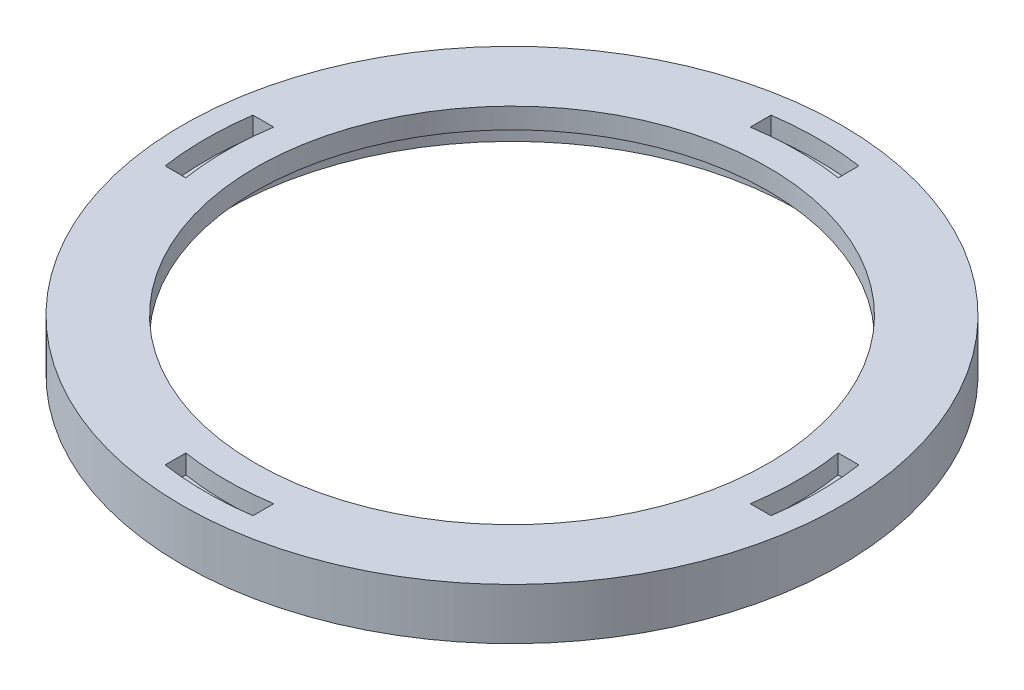
ISO-10303-21;
HEADER;
FILE_DESCRIPTION(('STEP AP214'),'2;1');
FILE_NAME('part.step','',(''),(''),'','','');
FILE_SCHEMA(('AUTOMOTIVE_DESIGN { 1 0 10303 214 1 1 1 1 }'));
ENDSEC;
DATA;
#1=APPLICATION_CONTEXT('core data for automotive mechanical design processes');
#2=APPLICATION_PROTOCOL_DEFINITION('international standard','automotive_design',2000,#1);
#3=PRODUCT_CONTEXT('',#1,'mechanical');
#4=PRODUCT('Part','Part','',(#3));
#5=PRODUCT_RELATED_PRODUCT_CATEGORY('part','',(#4));
#6=PRODUCT_DEFINITION_FORMATION('','',#4);
#7=PRODUCT_DEFINITION_CONTEXT('part definition',#1,'design');
#8=PRODUCT_DEFINITION('design','',#6,#7);
#9=PRODUCT_DEFINITION_SHAPE('','',#8);
#10=(LENGTH_UNIT() NAMED_UNIT(*) SI_UNIT(.MILLI.,.METRE.));
#11=(NAMED_UNIT(*) PLANE_ANGLE_UNIT() SI_UNIT($,.RADIAN.));
#12=(NAMED_UNIT(*) SI_UNIT($,.STERADIAN.) SOLID_ANGLE_UNIT());
#13=UNCERTAINTY_MEASURE_WITH_UNIT(LENGTH_MEASURE(1.E-05),#10,'distance_accuracy_value','');
#14=(GEOMETRIC_REPRESENTATION_CONTEXT(3) GLOBAL_UNCERTAINTY_ASSIGNED_CONTEXT((#13)) GLOBAL_UNIT_ASSIGNED_CONTEXT((#10,
#11,#12)) REPRESENTATION_CONTEXT('',''));
#15=CARTESIAN_POINT('',(0.,0.,0.));
#16=DIRECTION('',(0.,0.,1.));
#17=DIRECTION('',(1.,0.,0.));
#18=AXIS2_PLACEMENT_3D('',#15,#16,#17);
#19=CARTESIAN_POINT('',(0.,-4.445,0.));
#20=DIRECTION('',(0.,1.,0.));
#21=DIRECTION('',(0.,0.,1.));
#22=AXIS2_PLACEMENT_3D('',#19,#20,#21);
#23=CYLINDRICAL_SURFACE('',#22,22.225);
#24=CARTESIAN_POINT('',(0.,0.,0.));
#25=DIRECTION('',(0.,1.,0.));
#26=DIRECTION('',(0.,0.,1.));
#27=AXIS2_PLACEMENT_3D('',#24,#25,#26);
#28=CIRCLE('',#27,22.225);
#29=CARTESIAN_POINT('',(0.,0.,22.225));
#30=VERTEX_POINT('',#29);
#31=EDGE_CURVE('E275',#30,#30,#28,.T.);
#32=ORIENTED_EDGE('',*,*,#31,.T.);
#33=EDGE_LOOP('',(#32));
#34=FACE_BOUND('',#33,.T.);
#35=CARTESIAN_POINT('',(0.,-1.778,0.));
#36=DIRECTION('',(0.,-1.,0.));
#37=DIRECTION('',(0.,0.,-1.));
#38=AXIS2_PLACEMENT_3D('',#35,#36,#37);
#39=CIRCLE('',#38,22.225);
#40=CARTESIAN_POINT('',(0.,-1.778,-22.225));
#41=VERTEX_POINT('',#40);
#42=EDGE_CURVE('E38',#41,#41,#39,.F.);
#43=ORIENTED_EDGE('',*,*,#42,.F.);
#44=EDGE_LOOP('',(#43));
#45=FACE_BOUND('',#44,.T.);
#46=ADVANCED_FACE('F34',(#34,#45),#23,.F.);
#47=CARTESIAN_POINT('',(0.,0.,0.));
#48=DIRECTION('',(0.,1.,0.));
#49=DIRECTION('',(0.,0.,1.));
#50=AXIS2_PLACEMENT_3D('',#47,#48,#49);
#51=PLANE('',#50);
#52=CARTESIAN_POINT('',(0.,0.,0.));
#53=DIRECTION('',(0.,-1.,0.));
#54=DIRECTION('',(0.,0.,-1.));
#55=AXIS2_PLACEMENT_3D('',#52,#53,#54);
#56=CIRCLE('',#55,24.765);
#57=CARTESIAN_POINT('',(3.81000000000008,0.,24.4701680623571));
#58=VERTEX_POINT('',#57);
#59=CARTESIAN_POINT('',(-3.80999999999992,0.,24.4701680623571));
#60=VERTEX_POINT('',#59);
#61=EDGE_CURVE('E51',#58,#60,#56,.T.);
#62=ORIENTED_EDGE('',*,*,#61,.F.);
#63=DIRECTION('',(0.,0.,1.));
#64=VECTOR('',#63,1.);
#65=CARTESIAN_POINT('',(3.81000000000008,0.,24.4701680623571));
#66=LINE('',#65,#64);
#67=CARTESIAN_POINT('',(3.81000000000008,0.,26.2681318140442));
#68=VERTEX_POINT('',#67);
#69=EDGE_CURVE('E169',#58,#68,#66,.T.);
#70=ORIENTED_EDGE('',*,*,#69,.T.);
#71=CARTESIAN_POINT('',(0.,0.,0.));
#72=DIRECTION('',(0.,-1.,0.));
#73=DIRECTION('',(0.,0.,-1.));
#74=AXIS2_PLACEMENT_3D('',#71,#72,#73);
#75=CIRCLE('',#74,26.543);
#76=CARTESIAN_POINT('',(-3.80999999999991,0.,26.2681318140442));
#77=VERTEX_POINT('',#76);
#78=EDGE_CURVE('E172',#68,#77,#75,.T.);
#79=ORIENTED_EDGE('',*,*,#78,.T.);
#80=DIRECTION('',(0.,0.,1.));
#81=VECTOR('',#80,1.);
#82=CARTESIAN_POINT('',(-3.80999999999992,0.,24.4701680623571));
#83=LINE('',#82,#81);
#84=EDGE_CURVE('E181',#60,#77,#83,.T.);
#85=ORIENTED_EDGE('',*,*,#84,.F.);
#86=EDGE_LOOP('',(#62,#70,#79,#85));
#87=FACE_BOUND('',#86,.T.);
#88=CARTESIAN_POINT('',(0.,0.,0.));
#89=DIRECTION('',(0.,1.,0.));
#90=DIRECTION('',(0.,0.,1.));
#91=AXIS2_PLACEMENT_3D('',#88,#89,#90);
#92=CIRCLE('',#91,26.543);
#93=CARTESIAN_POINT('',(-26.2681318140442,0.,-3.81000000000001));
#94=VERTEX_POINT('',#93);
#95=CARTESIAN_POINT('',(-26.2681318140442,0.,3.80999999999998));
#96=VERTEX_POINT('',#95);
#97=EDGE_CURVE('E59',#94,#96,#92,.T.);
#98=ORIENTED_EDGE('',*,*,#97,.F.);
#99=DIRECTION('',(-1.,0.,0.));
#100=VECTOR('',#99,1.);
#101=CARTESIAN_POINT('',(-24.4701680623571,0.,-3.80999999999999));
#102=LINE('',#101,#100);
#103=CARTESIAN_POINT('',(-24.4701680623571,0.,-3.80999999999999));
#104=VERTEX_POINT('',#103);
#105=EDGE_CURVE('E194',#104,#94,#102,.T.);
#106=ORIENTED_EDGE('',*,*,#105,.F.);
#107=CARTESIAN_POINT('',(0.,0.,0.));
#108=DIRECTION('',(0.,1.,0.));
#109=DIRECTION('',(0.,0.,1.));
#110=AXIS2_PLACEMENT_3D('',#107,#108,#109);
#111=CIRCLE('',#110,24.765);
#112=CARTESIAN_POINT('',(-24.4701680623571,0.,3.81));
#113=VERTEX_POINT('',#112);
#114=EDGE_CURVE('E206',#104,#113,#111,.T.);
#115=ORIENTED_EDGE('',*,*,#114,.T.);
#116=DIRECTION('',(-1.,0.,0.));
#117=VECTOR('',#116,1.);
#118=CARTESIAN_POINT('',(-24.4701680623571,0.,3.81000000000001));
#119=LINE('',#118,#117);
#120=EDGE_CURVE('E203',#113,#96,#119,.T.);
#121=ORIENTED_EDGE('',*,*,#120,.T.);
#122=EDGE_LOOP('',(#98,#106,#115,#121));
#123=FACE_BOUND('',#122,.T.);
#124=CARTESIAN_POINT('',(0.,0.,0.));
#125=DIRECTION('',(0.,1.,0.));
#126=DIRECTION('',(0.,0.,1.));
#127=AXIS2_PLACEMENT_3D('',#124,#125,#126);
#128=CIRCLE('',#127,28.575);
#129=CARTESIAN_POINT('',(0.,0.,28.575));
#130=VERTEX_POINT('',#129);
#131=EDGE_CURVE('E43',#130,#130,#128,.T.);
#132=ORIENTED_EDGE('',*,*,#131,.T.);
#133=EDGE_LOOP('',(#132));
#134=FACE_BOUND('',#133,.T.);
#135=ORIENTED_EDGE('',*,*,#31,.F.);
#136=EDGE_LOOP('',(#135));
#137=FACE_BOUND('',#136,.T.);
#138=CARTESIAN_POINT('',(0.,0.,0.));
#139=DIRECTION('',(0.,-1.,0.));
#140=DIRECTION('',(0.,0.,-1.));
#141=AXIS2_PLACEMENT_3D('',#138,#139,#140);
#142=CIRCLE('',#141,24.765);
#143=CARTESIAN_POINT('',(-3.81000000000009,0.,-24.4701680623571));
#144=VERTEX_POINT('',#143);
#145=CARTESIAN_POINT('',(3.80999999999991,0.,-24.4701680623571));
#146=VERTEX_POINT('',#145);
#147=EDGE_CURVE('E251',#144,#146,#142,.T.);
#148=ORIENTED_EDGE('',*,*,#147,.F.);
#149=DIRECTION('',(0.,0.,-1.));
#150=VECTOR('',#149,1.);
#151=CARTESIAN_POINT('',(-3.81000000000009,0.,-24.4701680623571));
#152=LINE('',#151,#150);
#153=CARTESIAN_POINT('',(-3.81000000000009,0.,-26.2681318140442));
#154=VERTEX_POINT('',#153);
#155=EDGE_CURVE('E256',#144,#154,#152,.T.);
#156=ORIENTED_EDGE('',*,*,#155,.T.);
#157=CARTESIAN_POINT('',(0.,0.,0.));
#158=DIRECTION('',(0.,-1.,0.));
#159=DIRECTION('',(0.,0.,-1.));
#160=AXIS2_PLACEMENT_3D('',#157,#158,#159);
#161=CIRCLE('',#160,26.543);
#162=CARTESIAN_POINT('',(3.8099999999999,0.,-26.2681318140442));
#163=VERTEX_POINT('',#162);
#164=EDGE_CURVE('E268',#154,#163,#161,.T.);
#165=ORIENTED_EDGE('',*,*,#164,.T.);
#166=DIRECTION('',(0.,0.,-1.));
#167=VECTOR('',#166,1.);
#168=CARTESIAN_POINT('',(3.80999999999991,0.,-24.4701680623571));
#169=LINE('',#168,#167);
#170=EDGE_CURVE('E265',#146,#163,#169,.T.);
#171=ORIENTED_EDGE('',*,*,#170,.F.);
#172=EDGE_LOOP('',(#148,#156,#165,#171));
#173=FACE_BOUND('',#172,.T.);
#174=DIRECTION('',(1.,0.,0.));
#175=VECTOR('',#174,1.);
#176=CARTESIAN_POINT('',(24.4701680623571,0.,3.81));
#177=LINE('',#176,#175);
#178=CARTESIAN_POINT('',(24.4701680623571,0.,3.81));
#179=VERTEX_POINT('',#178);
#180=CARTESIAN_POINT('',(26.2681318140442,0.,3.81));
#181=VERTEX_POINT('',#180);
#182=EDGE_CURVE('E223',#179,#181,#177,.T.);
#183=ORIENTED_EDGE('',*,*,#182,.F.);
#184=CARTESIAN_POINT('',(0.,0.,0.));
#185=DIRECTION('',(0.,1.,0.));
#186=DIRECTION('',(0.,0.,1.));
#187=AXIS2_PLACEMENT_3D('',#184,#185,#186);
#188=CIRCLE('',#187,24.765);
#189=CARTESIAN_POINT('',(24.4701680623571,0.,-3.81));
#190=VERTEX_POINT('',#189);
#191=EDGE_CURVE('E213',#179,#190,#188,.T.);
#192=ORIENTED_EDGE('',*,*,#191,.T.);
#193=DIRECTION('',(1.,0.,0.));
#194=VECTOR('',#193,1.);
#195=CARTESIAN_POINT('',(24.4701680623571,0.,-3.81));
#196=LINE('',#195,#194);
#197=CARTESIAN_POINT('',(26.2681318140442,0.,-3.81));
#198=VERTEX_POINT('',#197);
#199=EDGE_CURVE('E234',#190,#198,#196,.T.);
#200=ORIENTED_EDGE('',*,*,#199,.T.);
#201=CARTESIAN_POINT('',(0.,0.,0.));
#202=DIRECTION('',(0.,1.,0.));
#203=DIRECTION('',(0.,0.,1.));
#204=AXIS2_PLACEMENT_3D('',#201,#202,#203);
#205=CIRCLE('',#204,26.543);
#206=EDGE_CURVE('E237',#181,#198,#205,.T.);
#207=ORIENTED_EDGE('',*,*,#206,.F.);
#208=EDGE_LOOP('',(#183,#192,#200,#207));
#209=FACE_BOUND('',#208,.T.);
#210=ADVANCED_FACE('F290',(#87,#123,#134,#137,#173,#209),#51,.T.);
#211=CARTESIAN_POINT('',(0.,-4.445,0.));
#212=DIRECTION('',(0.,1.,0.));
#213=DIRECTION('',(0.,0.,1.));
#214=AXIS2_PLACEMENT_3D('',#211,#212,#213);
#215=CYLINDRICAL_SURFACE('',#214,28.575);
#216=CARTESIAN_POINT('',(0.,-4.445,0.));
#217=DIRECTION('',(0.,1.,0.));
#218=DIRECTION('',(0.,0.,1.));
#219=AXIS2_PLACEMENT_3D('',#216,#217,#218);
#220=CIRCLE('',#219,28.575);
#221=CARTESIAN_POINT('',(0.,-4.445,28.575));
#222=VERTEX_POINT('',#221);
#223=EDGE_CURVE('E11',#222,#222,#220,.T.);
#224=ORIENTED_EDGE('',*,*,#223,.T.);
#225=EDGE_LOOP('',(#224));
#226=FACE_BOUND('',#225,.T.);
#227=ORIENTED_EDGE('',*,*,#131,.F.);
#228=EDGE_LOOP('',(#227));
#229=FACE_BOUND('',#228,.T.);
#230=ADVANCED_FACE('F36',(#226,#229),#215,.T.);
#231=CARTESIAN_POINT('',(0.,-4.445,0.));
#232=DIRECTION('',(0.,1.,0.));
#233=DIRECTION('',(0.,0.,1.));
#234=AXIS2_PLACEMENT_3D('',#231,#232,#233);
#235=PLANE('',#234);
#236=CARTESIAN_POINT('',(0.,-4.445,0.));
#237=DIRECTION('',(0.,-1.,0.));
#238=DIRECTION('',(0.,0.,-1.));
#239=AXIS2_PLACEMENT_3D('',#236,#237,#238);
#240=CIRCLE('',#239,24.765);
#241=CARTESIAN_POINT('',(0.,-4.445,-24.765));
#242=VERTEX_POINT('',#241);
#243=EDGE_CURVE('E175',#242,#242,#240,.T.);
#244=ORIENTED_EDGE('',*,*,#243,.F.);
#245=EDGE_LOOP('',(#244));
#246=FACE_BOUND('',#245,.T.);
#247=ORIENTED_EDGE('',*,*,#223,.F.);
#248=EDGE_LOOP('',(#247));
#249=FACE_BOUND('',#248,.T.);
#250=ADVANCED_FACE('F294',(#246,#249),#235,.F.);
#251=CARTESIAN_POINT('',(0.,-1.651,0.));
#252=DIRECTION('',(0.,1.,0.));
#253=DIRECTION('',(0.,0.,1.));
#254=AXIS2_PLACEMENT_3D('',#251,#252,#253);
#255=CYLINDRICAL_SURFACE('',#254,24.765);
#256=ORIENTED_EDGE('',*,*,#147,.T.);
#257=DIRECTION('',(0.,1.,0.));
#258=VECTOR('',#257,1.);
#259=CARTESIAN_POINT('',(3.80999999999991,-1.651,-24.4701680623571));
#260=LINE('',#259,#258);
#261=CARTESIAN_POINT('',(3.80999999999991,-1.651,-24.4701680623571));
#262=VERTEX_POINT('',#261);
#263=EDGE_CURVE('E263',#262,#146,#260,.T.);
#264=ORIENTED_EDGE('',*,*,#263,.F.);
#265=CARTESIAN_POINT('',(0.,-1.651,0.));
#266=DIRECTION('',(0.,-1.,0.));
#267=DIRECTION('',(0.,0.,-1.));
#268=AXIS2_PLACEMENT_3D('',#265,#266,#267);
#269=CIRCLE('',#268,24.765);
#270=CARTESIAN_POINT('',(-3.81000000000009,-1.651,-24.4701680623571));
#271=VERTEX_POINT('',#270);
#272=EDGE_CURVE('E252',#271,#262,#269,.T.);
#273=ORIENTED_EDGE('',*,*,#272,.F.);
#274=DIRECTION('',(0.,1.,0.));
#275=VECTOR('',#274,1.);
#276=CARTESIAN_POINT('',(-3.81000000000009,-1.651,-24.4701680623571));
#277=LINE('',#276,#275);
#278=EDGE_CURVE('E273',#271,#144,#277,.T.);
#279=ORIENTED_EDGE('',*,*,#278,.T.);
#280=EDGE_LOOP('',(#256,#264,#273,#279));
#281=FACE_BOUND('',#280,.T.);
#282=ADVANCED_FACE('F300',(#281),#255,.T.);
#283=CARTESIAN_POINT('',(-3.81000000000009,-1.651,-24.4701680623571));
#284=DIRECTION('',(1.,0.,0.));
#285=DIRECTION('',(0.,0.,-1.));
#286=AXIS2_PLACEMENT_3D('',#283,#284,#285);
#287=PLANE('',#286);
#288=ORIENTED_EDGE('',*,*,#155,.F.);
#289=ORIENTED_EDGE('',*,*,#278,.F.);
#290=DIRECTION('',(0.,0.,-1.));
#291=VECTOR('',#290,1.);
#292=CARTESIAN_POINT('',(-3.81000000000009,-1.651,-24.4701680623571));
#293=LINE('',#292,#291);
#294=CARTESIAN_POINT('',(-3.81000000000009,-1.651,-26.2681318140442));
#295=VERTEX_POINT('',#294);
#296=EDGE_CURVE('E261',#271,#295,#293,.T.);
#297=ORIENTED_EDGE('',*,*,#296,.T.);
#298=DIRECTION('',(0.,1.,0.));
#299=VECTOR('',#298,1.);
#300=CARTESIAN_POINT('',(-3.81000000000009,-1.651,-26.2681318140442));
#301=LINE('',#300,#299);
#302=EDGE_CURVE('E276',#295,#154,#301,.T.);
#303=ORIENTED_EDGE('',*,*,#302,.T.);
#304=EDGE_LOOP('',(#288,#289,#297,#303));
#305=FACE_BOUND('',#304,.T.);
#306=ADVANCED_FACE('F313',(#305),#287,.T.);
#307=CARTESIAN_POINT('',(0.,-1.651,0.));
#308=DIRECTION('',(0.,1.,0.));
#309=DIRECTION('',(0.,0.,1.));
#310=AXIS2_PLACEMENT_3D('',#307,#308,#309);
#311=CYLINDRICAL_SURFACE('',#310,26.543);
#312=ORIENTED_EDGE('',*,*,#164,.F.);
#313=ORIENTED_EDGE('',*,*,#302,.F.);
#314=CARTESIAN_POINT('',(0.,-1.651,0.));
#315=DIRECTION('',(0.,-1.,0.));
#316=DIRECTION('',(0.,0.,-1.));
#317=AXIS2_PLACEMENT_3D('',#314,#315,#316);
#318=CIRCLE('',#317,26.543);
#319=CARTESIAN_POINT('',(3.8099999999999,-1.651,-26.2681318140442));
#320=VERTEX_POINT('',#319);
#321=EDGE_CURVE('E259',#295,#320,#318,.T.);
#322=ORIENTED_EDGE('',*,*,#321,.T.);
#323=DIRECTION('',(0.,1.,0.));
#324=VECTOR('',#323,1.);
#325=CARTESIAN_POINT('',(3.8099999999999,-1.651,-26.2681318140442));
#326=LINE('',#325,#324);
#327=EDGE_CURVE('E278',#320,#163,#326,.T.);
#328=ORIENTED_EDGE('',*,*,#327,.T.);
#329=EDGE_LOOP('',(#312,#313,#322,#328));
#330=FACE_BOUND('',#329,.T.);
#331=ADVANCED_FACE('F319',(#330),#311,.F.);
#332=CARTESIAN_POINT('',(3.80999999999991,-1.651,-24.4701680623571));
#333=DIRECTION('',(1.,0.,0.));
#334=DIRECTION('',(0.,0.,-1.));
#335=AXIS2_PLACEMENT_3D('',#332,#333,#334);
#336=PLANE('',#335);
#337=ORIENTED_EDGE('',*,*,#170,.T.);
#338=ORIENTED_EDGE('',*,*,#327,.F.);
#339=DIRECTION('',(0.,0.,-1.));
#340=VECTOR('',#339,1.);
#341=CARTESIAN_POINT('',(3.80999999999991,-1.651,-24.4701680623571));
#342=LINE('',#341,#340);
#343=EDGE_CURVE('E255',#262,#320,#342,.T.);
#344=ORIENTED_EDGE('',*,*,#343,.F.);
#345=ORIENTED_EDGE('',*,*,#263,.T.);
#346=EDGE_LOOP('',(#337,#338,#344,#345));
#347=FACE_BOUND('',#346,.T.);
#348=ADVANCED_FACE('F315',(#347),#336,.F.);
#349=CARTESIAN_POINT('',(0.,-1.651,0.));
#350=DIRECTION('',(0.,-1.,0.));
#351=DIRECTION('',(0.,0.,-1.));
#352=AXIS2_PLACEMENT_3D('',#349,#350,#351);
#353=PLANE('',#352);
#354=ORIENTED_EDGE('',*,*,#272,.T.);
#355=ORIENTED_EDGE('',*,*,#343,.T.);
#356=ORIENTED_EDGE('',*,*,#321,.F.);
#357=ORIENTED_EDGE('',*,*,#296,.F.);
#358=EDGE_LOOP('',(#354,#355,#356,#357));
#359=FACE_BOUND('',#358,.T.);
#360=ADVANCED_FACE('F318',(#359),#353,.F.);
#361=CARTESIAN_POINT('',(0.,-1.651,0.));
#362=DIRECTION('',(0.,1.,0.));
#363=DIRECTION('',(0.,0.,1.));
#364=AXIS2_PLACEMENT_3D('',#361,#362,#363);
#365=CYLINDRICAL_SURFACE('',#364,24.765);
#366=ORIENTED_EDGE('',*,*,#191,.F.);
#367=DIRECTION('',(0.,1.,0.));
#368=VECTOR('',#367,1.);
#369=CARTESIAN_POINT('',(24.4701680623571,-1.651,3.81));
#370=LINE('',#369,#368);
#371=CARTESIAN_POINT('',(24.4701680623571,-1.651,3.81));
#372=VERTEX_POINT('',#371);
#373=EDGE_CURVE('E231',#372,#179,#370,.T.);
#374=ORIENTED_EDGE('',*,*,#373,.F.);
#375=CARTESIAN_POINT('',(0.,-1.651,0.));
#376=DIRECTION('',(0.,1.,0.));
#377=DIRECTION('',(0.,0.,1.));
#378=AXIS2_PLACEMENT_3D('',#375,#376,#377);
#379=CIRCLE('',#378,24.765);
#380=CARTESIAN_POINT('',(24.4701680623571,-1.651,-3.81));
#381=VERTEX_POINT('',#380);
#382=EDGE_CURVE('E219',#372,#381,#379,.T.);
#383=ORIENTED_EDGE('',*,*,#382,.T.);
#384=DIRECTION('',(0.,1.,0.));
#385=VECTOR('',#384,1.);
#386=CARTESIAN_POINT('',(24.4701680623571,-1.651,-3.81));
#387=LINE('',#386,#385);
#388=EDGE_CURVE('E248',#381,#190,#387,.T.);
#389=ORIENTED_EDGE('',*,*,#388,.T.);
#390=EDGE_LOOP('',(#366,#374,#383,#389));
#391=FACE_BOUND('',#390,.T.);
#392=ADVANCED_FACE('F329',(#391),#365,.T.);
#393=CARTESIAN_POINT('',(24.4701680623571,-1.651,-3.81));
#394=DIRECTION('',(0.,0.,1.));
#395=DIRECTION('',(1.,0.,0.));
#396=AXIS2_PLACEMENT_3D('',#393,#394,#395);
#397=PLANE('',#396);
#398=ORIENTED_EDGE('',*,*,#199,.F.);
#399=ORIENTED_EDGE('',*,*,#388,.F.);
#400=DIRECTION('',(1.,0.,0.));
#401=VECTOR('',#400,1.);
#402=CARTESIAN_POINT('',(24.4701680623571,-1.651,-3.81));
#403=LINE('',#402,#401);
#404=CARTESIAN_POINT('',(26.2681318140442,-1.651,-3.81));
#405=VERTEX_POINT('',#404);
#406=EDGE_CURVE('E222',#381,#405,#403,.T.);
#407=ORIENTED_EDGE('',*,*,#406,.T.);
#408=DIRECTION('',(0.,1.,0.));
#409=VECTOR('',#408,1.);
#410=CARTESIAN_POINT('',(26.2681318140442,-1.651,-3.81));
#411=LINE('',#410,#409);
#412=EDGE_CURVE('E246',#405,#198,#411,.T.);
#413=ORIENTED_EDGE('',*,*,#412,.T.);
#414=EDGE_LOOP('',(#398,#399,#407,#413));
#415=FACE_BOUND('',#414,.T.);
#416=ADVANCED_FACE('F333',(#415),#397,.T.);
#417=CARTESIAN_POINT('',(0.,-1.651,0.));
#418=DIRECTION('',(0.,1.,0.));
#419=DIRECTION('',(0.,0.,1.));
#420=AXIS2_PLACEMENT_3D('',#417,#418,#419);
#421=CYLINDRICAL_SURFACE('',#420,26.543);
#422=ORIENTED_EDGE('',*,*,#206,.T.);
#423=ORIENTED_EDGE('',*,*,#412,.F.);
#424=CARTESIAN_POINT('',(0.,-1.651,0.));
#425=DIRECTION('',(0.,1.,0.));
#426=DIRECTION('',(0.,0.,1.));
#427=AXIS2_PLACEMENT_3D('',#424,#425,#426);
#428=CIRCLE('',#427,26.543);
#429=CARTESIAN_POINT('',(26.2681318140442,-1.651,3.81));
#430=VERTEX_POINT('',#429);
#431=EDGE_CURVE('E225',#430,#405,#428,.T.);
#432=ORIENTED_EDGE('',*,*,#431,.F.);
#433=DIRECTION('',(0.,1.,0.));
#434=VECTOR('',#433,1.);
#435=CARTESIAN_POINT('',(26.2681318140442,-1.651,3.81));
#436=LINE('',#435,#434);
#437=EDGE_CURVE('E244',#430,#181,#436,.T.);
#438=ORIENTED_EDGE('',*,*,#437,.T.);
#439=EDGE_LOOP('',(#422,#423,#432,#438));
#440=FACE_BOUND('',#439,.T.);
#441=ADVANCED_FACE('F337',(#440),#421,.F.);
#442=CARTESIAN_POINT('',(24.4701680623571,-1.651,3.81));
#443=DIRECTION('',(0.,0.,1.));
#444=DIRECTION('',(1.,0.,0.));
#445=AXIS2_PLACEMENT_3D('',#442,#443,#444);
#446=PLANE('',#445);
#447=ORIENTED_EDGE('',*,*,#182,.T.);
#448=ORIENTED_EDGE('',*,*,#437,.F.);
#449=DIRECTION('',(1.,0.,0.));
#450=VECTOR('',#449,1.);
#451=CARTESIAN_POINT('',(24.4701680623571,-1.651,3.81));
#452=LINE('',#451,#450);
#453=EDGE_CURVE('E228',#372,#430,#452,.T.);
#454=ORIENTED_EDGE('',*,*,#453,.F.);
#455=ORIENTED_EDGE('',*,*,#373,.T.);
#456=EDGE_LOOP('',(#447,#448,#454,#455));
#457=FACE_BOUND('',#456,.T.);
#458=ADVANCED_FACE('F341',(#457),#446,.F.);
#459=CARTESIAN_POINT('',(0.,-1.651,0.));
#460=DIRECTION('',(0.,1.,0.));
#461=DIRECTION('',(0.,0.,1.));
#462=AXIS2_PLACEMENT_3D('',#459,#460,#461);
#463=PLANE('',#462);
#464=ORIENTED_EDGE('',*,*,#382,.F.);
#465=ORIENTED_EDGE('',*,*,#453,.T.);
#466=ORIENTED_EDGE('',*,*,#431,.T.);
#467=ORIENTED_EDGE('',*,*,#406,.F.);
#468=EDGE_LOOP('',(#464,#465,#466,#467));
#469=FACE_BOUND('',#468,.T.);
#470=ADVANCED_FACE('F345',(#469),#463,.T.);
#471=CARTESIAN_POINT('',(0.,-1.651,0.));
#472=DIRECTION('',(0.,1.,0.));
#473=DIRECTION('',(0.,0.,1.));
#474=AXIS2_PLACEMENT_3D('',#471,#472,#473);
#475=CYLINDRICAL_SURFACE('',#474,26.543);
#476=ORIENTED_EDGE('',*,*,#97,.T.);
#477=DIRECTION('',(0.,1.,0.));
#478=VECTOR('',#477,1.);
#479=CARTESIAN_POINT('',(-26.2681318140442,-1.651,3.80999999999998));
#480=LINE('',#479,#478);
#481=CARTESIAN_POINT('',(-26.2681318140442,-1.651,3.80999999999998));
#482=VERTEX_POINT('',#481);
#483=EDGE_CURVE('E201',#482,#96,#480,.T.);
#484=ORIENTED_EDGE('',*,*,#483,.F.);
#485=CARTESIAN_POINT('',(0.,-1.651,0.));
#486=DIRECTION('',(0.,1.,0.));
#487=DIRECTION('',(0.,0.,1.));
#488=AXIS2_PLACEMENT_3D('',#485,#486,#487);
#489=CIRCLE('',#488,26.543);
#490=CARTESIAN_POINT('',(-26.2681318140442,-1.651,-3.81000000000001));
#491=VERTEX_POINT('',#490);
#492=EDGE_CURVE('E190',#491,#482,#489,.T.);
#493=ORIENTED_EDGE('',*,*,#492,.F.);
#494=DIRECTION('',(0.,1.,0.));
#495=VECTOR('',#494,1.);
#496=CARTESIAN_POINT('',(-26.2681318140442,-1.651,-3.81000000000001));
#497=LINE('',#496,#495);
#498=EDGE_CURVE('E211',#491,#94,#497,.T.);
#499=ORIENTED_EDGE('',*,*,#498,.T.);
#500=EDGE_LOOP('',(#476,#484,#493,#499));
#501=FACE_BOUND('',#500,.T.);
#502=ADVANCED_FACE('F349',(#501),#475,.F.);
#503=CARTESIAN_POINT('',(-24.4701680623571,-1.651,-3.80999999999999));
#504=DIRECTION('',(0.,0.,-1.));
#505=DIRECTION('',(-1.,0.,0.));
#506=AXIS2_PLACEMENT_3D('',#503,#504,#505);
#507=PLANE('',#506);
#508=ORIENTED_EDGE('',*,*,#105,.T.);
#509=ORIENTED_EDGE('',*,*,#498,.F.);
#510=DIRECTION('',(-1.,0.,0.));
#511=VECTOR('',#510,1.);
#512=CARTESIAN_POINT('',(-24.4701680623571,-1.651,-3.80999999999999));
#513=LINE('',#512,#511);
#514=CARTESIAN_POINT('',(-24.4701680623571,-1.651,-3.80999999999999));
#515=VERTEX_POINT('',#514);
#516=EDGE_CURVE('E198',#515,#491,#513,.T.);
#517=ORIENTED_EDGE('',*,*,#516,.F.);
#518=DIRECTION('',(0.,1.,0.));
#519=VECTOR('',#518,1.);
#520=CARTESIAN_POINT('',(-24.4701680623571,-1.651,-3.80999999999999));
#521=LINE('',#520,#519);
#522=EDGE_CURVE('E214',#515,#104,#521,.T.);
#523=ORIENTED_EDGE('',*,*,#522,.T.);
#524=EDGE_LOOP('',(#508,#509,#517,#523));
#525=FACE_BOUND('',#524,.T.);
#526=ADVANCED_FACE('F353',(#525),#507,.F.);
#527=CARTESIAN_POINT('',(0.,-1.651,0.));
#528=DIRECTION('',(0.,1.,0.));
#529=DIRECTION('',(0.,0.,1.));
#530=AXIS2_PLACEMENT_3D('',#527,#528,#529);
#531=CYLINDRICAL_SURFACE('',#530,24.765);
#532=ORIENTED_EDGE('',*,*,#114,.F.);
#533=ORIENTED_EDGE('',*,*,#522,.F.);
#534=CARTESIAN_POINT('',(0.,-1.651,0.));
#535=DIRECTION('',(0.,1.,0.));
#536=DIRECTION('',(0.,0.,1.));
#537=AXIS2_PLACEMENT_3D('',#534,#535,#536);
#538=CIRCLE('',#537,24.765);
#539=CARTESIAN_POINT('',(-24.4701680623571,-1.651,3.81));
#540=VERTEX_POINT('',#539);
#541=EDGE_CURVE('E196',#515,#540,#538,.T.);
#542=ORIENTED_EDGE('',*,*,#541,.T.);
#543=DIRECTION('',(0.,1.,0.));
#544=VECTOR('',#543,1.);
#545=CARTESIAN_POINT('',(-24.4701680623571,-1.651,3.81));
#546=LINE('',#545,#544);
#547=EDGE_CURVE('E216',#540,#113,#546,.T.);
#548=ORIENTED_EDGE('',*,*,#547,.T.);
#549=EDGE_LOOP('',(#532,#533,#542,#548));
#550=FACE_BOUND('',#549,.T.);
#551=ADVANCED_FACE('F358',(#550),#531,.T.);
#552=CARTESIAN_POINT('',(-24.4701680623571,-1.651,3.81000000000001));
#553=DIRECTION('',(0.,0.,-1.));
#554=DIRECTION('',(-1.,0.,0.));
#555=AXIS2_PLACEMENT_3D('',#552,#553,#554);
#556=PLANE('',#555);
#557=ORIENTED_EDGE('',*,*,#120,.F.);
#558=ORIENTED_EDGE('',*,*,#547,.F.);
#559=DIRECTION('',(-1.,0.,0.));
#560=VECTOR('',#559,1.);
#561=CARTESIAN_POINT('',(-24.4701680623571,-1.651,3.81000000000001));
#562=LINE('',#561,#560);
#563=EDGE_CURVE('E193',#540,#482,#562,.T.);
#564=ORIENTED_EDGE('',*,*,#563,.T.);
#565=ORIENTED_EDGE('',*,*,#483,.T.);
#566=EDGE_LOOP('',(#557,#558,#564,#565));
#567=FACE_BOUND('',#566,.T.);
#568=ADVANCED_FACE('F354',(#567),#556,.T.);
#569=CARTESIAN_POINT('',(0.,-1.651,0.));
#570=DIRECTION('',(0.,1.,0.));
#571=DIRECTION('',(0.,0.,1.));
#572=AXIS2_PLACEMENT_3D('',#569,#570,#571);
#573=PLANE('',#572);
#574=ORIENTED_EDGE('',*,*,#492,.T.);
#575=ORIENTED_EDGE('',*,*,#563,.F.);
#576=ORIENTED_EDGE('',*,*,#541,.F.);
#577=ORIENTED_EDGE('',*,*,#516,.T.);
#578=EDGE_LOOP('',(#574,#575,#576,#577));
#579=FACE_BOUND('',#578,.T.);
#580=ADVANCED_FACE('F357',(#579),#573,.T.);
#581=CARTESIAN_POINT('',(0.,-1.651,0.));
#582=DIRECTION('',(0.,1.,0.));
#583=DIRECTION('',(0.,0.,1.));
#584=AXIS2_PLACEMENT_3D('',#581,#582,#583);
#585=CYLINDRICAL_SURFACE('',#584,24.765);
#586=ORIENTED_EDGE('',*,*,#61,.T.);
#587=DIRECTION('',(0.,1.,0.));
#588=VECTOR('',#587,1.);
#589=CARTESIAN_POINT('',(-3.80999999999992,-1.651,24.4701680623571));
#590=LINE('',#589,#588);
#591=CARTESIAN_POINT('',(-3.80999999999992,-1.651,24.4701680623571));
#592=VERTEX_POINT('',#591);
#593=EDGE_CURVE('E148',#592,#60,#590,.T.);
#594=ORIENTED_EDGE('',*,*,#593,.F.);
#595=CARTESIAN_POINT('',(0.,-1.651,0.));
#596=DIRECTION('',(0.,-1.,0.));
#597=DIRECTION('',(0.,0.,-1.));
#598=AXIS2_PLACEMENT_3D('',#595,#596,#597);
#599=CIRCLE('',#598,24.765);
#600=CARTESIAN_POINT('',(3.81000000000008,-1.651,24.4701680623571));
#601=VERTEX_POINT('',#600);
#602=EDGE_CURVE('E152',#601,#592,#599,.T.);
#603=ORIENTED_EDGE('',*,*,#602,.F.);
#604=DIRECTION('',(0.,1.,0.));
#605=VECTOR('',#604,1.);
#606=CARTESIAN_POINT('',(3.81000000000008,-1.651,24.4701680623571));
#607=LINE('',#606,#605);
#608=EDGE_CURVE('E185',#601,#58,#607,.T.);
#609=ORIENTED_EDGE('',*,*,#608,.T.);
#610=EDGE_LOOP('',(#586,#594,#603,#609));
#611=FACE_BOUND('',#610,.T.);
#612=ADVANCED_FACE('F150',(#611),#585,.T.);
#613=CARTESIAN_POINT('',(3.81000000000008,-1.651,24.4701680623571));
#614=DIRECTION('',(-1.,0.,0.));
#615=DIRECTION('',(0.,0.,1.));
#616=AXIS2_PLACEMENT_3D('',#613,#614,#615);
#617=PLANE('',#616);
#618=ORIENTED_EDGE('',*,*,#69,.F.);
#619=ORIENTED_EDGE('',*,*,#608,.F.);
#620=DIRECTION('',(0.,0.,1.));
#621=VECTOR('',#620,1.);
#622=CARTESIAN_POINT('',(3.81000000000008,-1.651,24.4701680623571));
#623=LINE('',#622,#621);
#624=CARTESIAN_POINT('',(3.81000000000008,-1.651,26.2681318140442));
#625=VERTEX_POINT('',#624);
#626=EDGE_CURVE('E157',#601,#625,#623,.T.);
#627=ORIENTED_EDGE('',*,*,#626,.T.);
#628=DIRECTION('',(0.,1.,0.));
#629=VECTOR('',#628,1.);
#630=CARTESIAN_POINT('',(3.81000000000008,-1.651,26.2681318140442));
#631=LINE('',#630,#629);
#632=EDGE_CURVE('E187',#625,#68,#631,.T.);
#633=ORIENTED_EDGE('',*,*,#632,.T.);
#634=EDGE_LOOP('',(#618,#619,#627,#633));
#635=FACE_BOUND('',#634,.T.);
#636=ADVANCED_FACE('F371',(#635),#617,.T.);
#637=CARTESIAN_POINT('',(0.,-1.651,0.));
#638=DIRECTION('',(0.,1.,0.));
#639=DIRECTION('',(0.,0.,1.));
#640=AXIS2_PLACEMENT_3D('',#637,#638,#639);
#641=CYLINDRICAL_SURFACE('',#640,26.543);
#642=ORIENTED_EDGE('',*,*,#78,.F.);
#643=ORIENTED_EDGE('',*,*,#632,.F.);
#644=CARTESIAN_POINT('',(0.,-1.651,0.));
#645=DIRECTION('',(0.,-1.,0.));
#646=DIRECTION('',(0.,0.,-1.));
#647=AXIS2_PLACEMENT_3D('',#644,#645,#646);
#648=CIRCLE('',#647,26.543);
#649=CARTESIAN_POINT('',(-3.80999999999991,-1.651,26.2681318140442));
#650=VERTEX_POINT('',#649);
#651=EDGE_CURVE('E165',#625,#650,#648,.T.);
#652=ORIENTED_EDGE('',*,*,#651,.T.);
#653=DIRECTION('',(0.,1.,0.));
#654=VECTOR('',#653,1.);
#655=CARTESIAN_POINT('',(-3.80999999999991,-1.651,26.2681318140442));
#656=LINE('',#655,#654);
#657=EDGE_CURVE('E156',#650,#77,#656,.T.);
#658=ORIENTED_EDGE('',*,*,#657,.T.);
#659=EDGE_LOOP('',(#642,#643,#652,#658));
#660=FACE_BOUND('',#659,.T.);
#661=ADVANCED_FACE('F374',(#660),#641,.F.);
#662=CARTESIAN_POINT('',(-3.80999999999992,-1.651,24.4701680623571));
#663=DIRECTION('',(-1.,0.,0.));
#664=DIRECTION('',(0.,0.,1.));
#665=AXIS2_PLACEMENT_3D('',#662,#663,#664);
#666=PLANE('',#665);
#667=ORIENTED_EDGE('',*,*,#84,.T.);
#668=ORIENTED_EDGE('',*,*,#657,.F.);
#669=DIRECTION('',(0.,0.,1.));
#670=VECTOR('',#669,1.);
#671=CARTESIAN_POINT('',(-3.80999999999992,-1.651,24.4701680623571));
#672=LINE('',#671,#670);
#673=EDGE_CURVE('E161',#592,#650,#672,.T.);
#674=ORIENTED_EDGE('',*,*,#673,.F.);
#675=ORIENTED_EDGE('',*,*,#593,.T.);
#676=EDGE_LOOP('',(#667,#668,#674,#675));
#677=FACE_BOUND('',#676,.T.);
#678=ADVANCED_FACE('F162',(#677),#666,.F.);
#679=CARTESIAN_POINT('',(0.,-1.651,0.));
#680=DIRECTION('',(0.,-1.,0.));
#681=DIRECTION('',(0.,0.,-1.));
#682=AXIS2_PLACEMENT_3D('',#679,#680,#681);
#683=PLANE('',#682);
#684=ORIENTED_EDGE('',*,*,#602,.T.);
#685=ORIENTED_EDGE('',*,*,#673,.T.);
#686=ORIENTED_EDGE('',*,*,#651,.F.);
#687=ORIENTED_EDGE('',*,*,#626,.F.);
#688=EDGE_LOOP('',(#684,#685,#686,#687));
#689=FACE_BOUND('',#688,.T.);
#690=ADVANCED_FACE('F168',(#689),#683,.F.);
#691=CARTESIAN_POINT('',(0.,-1.778,0.));
#692=DIRECTION('',(0.,-1.,0.));
#693=DIRECTION('',(0.,0.,-1.));
#694=AXIS2_PLACEMENT_3D('',#691,#692,#693);
#695=PLANE('',#694);
#696=CARTESIAN_POINT('',(0.,-1.778,0.));
#697=DIRECTION('',(0.,-1.,0.));
#698=DIRECTION('',(0.,0.,-1.));
#699=AXIS2_PLACEMENT_3D('',#696,#697,#698);
#700=CIRCLE('',#699,24.765);
#701=CARTESIAN_POINT('',(0.,-1.778,-24.765));
#702=VERTEX_POINT('',#701);
#703=EDGE_CURVE('E395',#702,#702,#700,.T.);
#704=ORIENTED_EDGE('',*,*,#703,.T.);
#705=EDGE_LOOP('',(#704));
#706=FACE_BOUND('',#705,.T.);
#707=ORIENTED_EDGE('',*,*,#42,.T.);
#708=EDGE_LOOP('',(#707));
#709=FACE_BOUND('',#708,.T.);
#710=ADVANCED_FACE('F383',(#706,#709),#695,.T.);
#711=CARTESIAN_POINT('',(0.,-1.778,0.));
#712=DIRECTION('',(0.,-1.,0.));
#713=DIRECTION('',(0.,0.,-1.));
#714=AXIS2_PLACEMENT_3D('',#711,#712,#713);
#715=CYLINDRICAL_SURFACE('',#714,24.765);
#716=ORIENTED_EDGE('',*,*,#703,.F.);
#717=EDGE_LOOP('',(#716));
#718=FACE_BOUND('',#717,.T.);
#719=ORIENTED_EDGE('',*,*,#243,.T.);
#720=EDGE_LOOP('',(#719));
#721=FACE_BOUND('',#720,.T.);
#722=ADVANCED_FACE('F384',(#718,#721),#715,.F.);
#723=CLOSED_SHELL('',(#46,#210,#230,#250,#282,#306,#331,#348,#360,#392,#416,#441,#458,#470,#502,
#526,#551,#568,#580,#612,#636,#661,#678,#690,#710,#722));
#724=MANIFOLD_SOLID_BREP('B2',#723);
#725=ADVANCED_BREP_SHAPE_REPRESENTATION('',(#18,#724),#14);
#726=SHAPE_DEFINITION_REPRESENTATION(#9,#725);
ENDSEC;
END-ISO-10303-21;
